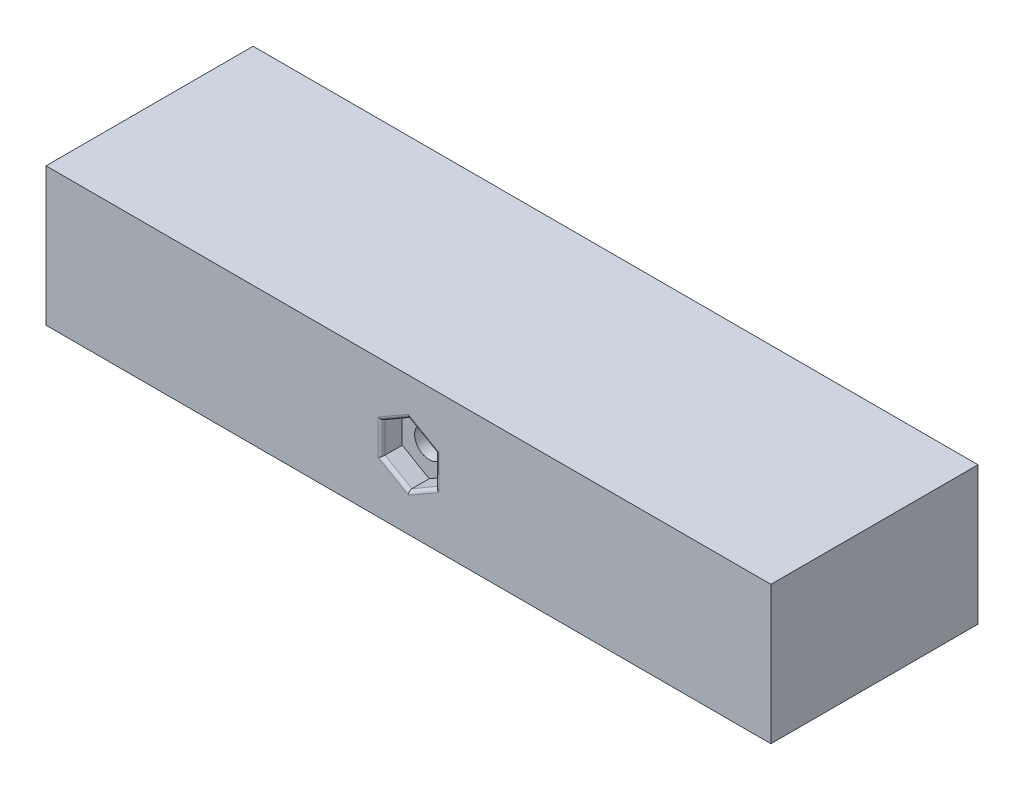
ISO-10303-21;
HEADER;
FILE_DESCRIPTION(('STEP AP214'),'2;1');
FILE_NAME('part.step','',(''),(''),'','','');
FILE_SCHEMA(('AUTOMOTIVE_DESIGN { 1 0 10303 214 1 1 1 1 }'));
ENDSEC;
DATA;
#1=APPLICATION_CONTEXT('core data for automotive mechanical design processes');
#2=APPLICATION_PROTOCOL_DEFINITION('international standard','automotive_design',2000,#1);
#3=PRODUCT_CONTEXT('',#1,'mechanical');
#4=PRODUCT('Part','Part','',(#3));
#5=PRODUCT_RELATED_PRODUCT_CATEGORY('part','',(#4));
#6=PRODUCT_DEFINITION_FORMATION('','',#4);
#7=PRODUCT_DEFINITION_CONTEXT('part definition',#1,'design');
#8=PRODUCT_DEFINITION('design','',#6,#7);
#9=PRODUCT_DEFINITION_SHAPE('','',#8);
#10=(LENGTH_UNIT() NAMED_UNIT(*) SI_UNIT(.MILLI.,.METRE.));
#11=(NAMED_UNIT(*) PLANE_ANGLE_UNIT() SI_UNIT($,.RADIAN.));
#12=(NAMED_UNIT(*) SI_UNIT($,.STERADIAN.) SOLID_ANGLE_UNIT());
#13=UNCERTAINTY_MEASURE_WITH_UNIT(LENGTH_MEASURE(1.E-05),#10,'distance_accuracy_value','');
#14=(GEOMETRIC_REPRESENTATION_CONTEXT(3) GLOBAL_UNCERTAINTY_ASSIGNED_CONTEXT((#13)) GLOBAL_UNIT_ASSIGNED_CONTEXT((#10,
#11,#12)) REPRESENTATION_CONTEXT('',''));
#15=CARTESIAN_POINT('',(0.,0.,0.));
#16=DIRECTION('',(0.,0.,1.));
#17=DIRECTION('',(1.,0.,0.));
#18=AXIS2_PLACEMENT_3D('',#15,#16,#17);
#19=CARTESIAN_POINT('',(0.,0.,0.));
#20=DIRECTION('',(0.,0.,1.));
#21=DIRECTION('',(1.,0.,0.));
#22=AXIS2_PLACEMENT_3D('',#19,#20,#21);
#23=PLANE('',#22);
#24=DIRECTION('',(0.,1.,0.));
#25=VECTOR('',#24,1.);
#26=CARTESIAN_POINT('',(0.,0.,0.));
#27=LINE('',#26,#25);
#28=CARTESIAN_POINT('',(0.,0.,0.));
#29=VERTEX_POINT('',#28);
#30=CARTESIAN_POINT('',(0.,20.,0.));
#31=VERTEX_POINT('',#30);
#32=EDGE_CURVE('E389',#29,#31,#27,.T.);
#33=ORIENTED_EDGE('',*,*,#32,.F.);
#34=DIRECTION('',(1.,0.,0.));
#35=VECTOR('',#34,1.);
#36=CARTESIAN_POINT('',(0.,0.,0.));
#37=LINE('',#36,#35);
#38=CARTESIAN_POINT('',(-105.,0.,0.));
#39=VERTEX_POINT('',#38);
#40=EDGE_CURVE('E408',#39,#29,#37,.T.);
#41=ORIENTED_EDGE('',*,*,#40,.F.);
#42=DIRECTION('',(0.,-1.,0.));
#43=VECTOR('',#42,1.);
#44=CARTESIAN_POINT('',(-105.,0.,0.));
#45=LINE('',#44,#43);
#46=CARTESIAN_POINT('',(-105.,20.,0.));
#47=VERTEX_POINT('',#46);
#48=EDGE_CURVE('E419',#47,#39,#45,.T.);
#49=ORIENTED_EDGE('',*,*,#48,.F.);
#50=DIRECTION('',(-1.,0.,0.));
#51=VECTOR('',#50,1.);
#52=CARTESIAN_POINT('',(0.,20.,0.));
#53=LINE('',#52,#51);
#54=EDGE_CURVE('E417',#31,#47,#53,.T.);
#55=ORIENTED_EDGE('',*,*,#54,.F.);
#56=EDGE_LOOP('',(#33,#41,#49,#55));
#57=FACE_BOUND('',#56,.T.);
#58=CARTESIAN_POINT('',(-52.5,9.99999999999999,0.));
#59=DIRECTION('',(0.,0.,1.));
#60=DIRECTION('',(1.,0.,0.));
#61=AXIS2_PLACEMENT_3D('',#58,#59,#60);
#62=CIRCLE('',#61,2.10377415285356);
#63=CARTESIAN_POINT('',(-50.3962258471464,9.99999999999999,0.));
#64=VERTEX_POINT('',#63);
#65=EDGE_CURVE('E361',#64,#64,#62,.T.);
#66=ORIENTED_EDGE('',*,*,#65,.T.);
#67=EDGE_LOOP('',(#66));
#68=FACE_BOUND('',#67,.T.);
#69=ADVANCED_FACE('F33',(#57,#68),#23,.F.);
#70=CARTESIAN_POINT('',(0.,0.,27.));
#71=DIRECTION('',(0.,0.,1.));
#72=DIRECTION('',(1.,0.,0.));
#73=AXIS2_PLACEMENT_3D('',#70,#71,#72);
#74=PLANE('',#73);
#75=DIRECTION('',(0.866025403784439,-0.499999999999999,0.));
#76=VECTOR('',#75,1.);
#77=CARTESIAN_POINT('',(-56.4,7.74833395016045,27.));
#78=LINE('',#77,#76);
#79=CARTESIAN_POINT('',(-56.4,7.74833395016045,27.));
#80=VERTEX_POINT('',#79);
#81=CARTESIAN_POINT('',(-52.5,5.49666790032091,27.));
#82=VERTEX_POINT('',#81);
#83=EDGE_CURVE('E366',#80,#82,#78,.T.);
#84=ORIENTED_EDGE('',*,*,#83,.T.);
#85=DIRECTION('',(0.866025403784438,0.500000000000001,0.));
#86=VECTOR('',#85,1.);
#87=CARTESIAN_POINT('',(-52.5,5.49666790032091,27.));
#88=LINE('',#87,#86);
#89=CARTESIAN_POINT('',(-48.6,7.74833395016046,27.));
#90=VERTEX_POINT('',#89);
#91=EDGE_CURVE('E369',#82,#90,#88,.T.);
#92=ORIENTED_EDGE('',*,*,#91,.T.);
#93=DIRECTION('',(0.,1.,0.));
#94=VECTOR('',#93,1.);
#95=CARTESIAN_POINT('',(-48.6,7.74833395016046,27.));
#96=LINE('',#95,#94);
#97=CARTESIAN_POINT('',(-48.6,12.2516660498395,27.));
#98=VERTEX_POINT('',#97);
#99=EDGE_CURVE('E373',#90,#98,#96,.T.);
#100=ORIENTED_EDGE('',*,*,#99,.T.);
#101=DIRECTION('',(-0.866025403784439,0.5,0.));
#102=VECTOR('',#101,1.);
#103=CARTESIAN_POINT('',(-48.6,12.2516660498395,27.));
#104=LINE('',#103,#102);
#105=CARTESIAN_POINT('',(-52.5,14.5033320996791,27.));
#106=VERTEX_POINT('',#105);
#107=EDGE_CURVE('E376',#98,#106,#104,.T.);
#108=ORIENTED_EDGE('',*,*,#107,.T.);
#109=DIRECTION('',(-0.866025403784438,-0.500000000000001,0.));
#110=VECTOR('',#109,1.);
#111=CARTESIAN_POINT('',(-52.5,14.5033320996791,27.));
#112=LINE('',#111,#110);
#113=CARTESIAN_POINT('',(-56.4,12.2516660498395,27.));
#114=VERTEX_POINT('',#113);
#115=EDGE_CURVE('E379',#106,#114,#112,.T.);
#116=ORIENTED_EDGE('',*,*,#115,.T.);
#117=DIRECTION('',(0.,-1.,0.));
#118=VECTOR('',#117,1.);
#119=CARTESIAN_POINT('',(-56.4,12.2516660498395,27.));
#120=LINE('',#119,#118);
#121=EDGE_CURVE('E382',#114,#80,#120,.T.);
#122=ORIENTED_EDGE('',*,*,#121,.T.);
#123=EDGE_LOOP('',(#84,#92,#100,#108,#116,#122));
#124=FACE_BOUND('',#123,.T.);
#125=CARTESIAN_POINT('',(-52.5,9.99999999999999,27.));
#126=DIRECTION('',(0.,0.,1.));
#127=DIRECTION('',(1.,0.,0.));
#128=AXIS2_PLACEMENT_3D('',#125,#126,#127);
#129=CIRCLE('',#128,2.10377415285356);
#130=CARTESIAN_POINT('',(-50.3962258471464,9.99999999999999,27.));
#131=VERTEX_POINT('',#130);
#132=EDGE_CURVE('E37',#131,#131,#129,.F.);
#133=ORIENTED_EDGE('',*,*,#132,.T.);
#134=EDGE_LOOP('',(#133));
#135=FACE_BOUND('',#134,.T.);
#136=ADVANCED_FACE('F499',(#124,#135),#74,.T.);
#137=CARTESIAN_POINT('',(0.,0.,30.));
#138=DIRECTION('',(-1.,0.,0.));
#139=DIRECTION('',(0.,-1.,0.));
#140=AXIS2_PLACEMENT_3D('',#137,#138,#139);
#141=PLANE('',#140);
#142=ORIENTED_EDGE('',*,*,#32,.T.);
#143=DIRECTION('',(0.,0.,-1.));
#144=VECTOR('',#143,1.);
#145=CARTESIAN_POINT('',(0.,20.,30.));
#146=LINE('',#145,#144);
#147=CARTESIAN_POINT('',(0.,20.,30.));
#148=VERTEX_POINT('',#147);
#149=EDGE_CURVE('E430',#148,#31,#146,.T.);
#150=ORIENTED_EDGE('',*,*,#149,.F.);
#151=DIRECTION('',(0.,1.,0.));
#152=VECTOR('',#151,1.);
#153=CARTESIAN_POINT('',(0.,0.,30.));
#154=LINE('',#153,#152);
#155=CARTESIAN_POINT('',(0.,0.,30.));
#156=VERTEX_POINT('',#155);
#157=EDGE_CURVE('E404',#156,#148,#154,.T.);
#158=ORIENTED_EDGE('',*,*,#157,.F.);
#159=DIRECTION('',(0.,0.,-1.));
#160=VECTOR('',#159,1.);
#161=CARTESIAN_POINT('',(0.,0.,30.));
#162=LINE('',#161,#160);
#163=EDGE_CURVE('E414',#156,#29,#162,.T.);
#164=ORIENTED_EDGE('',*,*,#163,.T.);
#165=EDGE_LOOP('',(#142,#150,#158,#164));
#166=FACE_BOUND('',#165,.T.);
#167=ADVANCED_FACE('F538',(#166),#141,.F.);
#168=CARTESIAN_POINT('',(0.,20.,30.));
#169=DIRECTION('',(0.,-1.,0.));
#170=DIRECTION('',(1.,0.,0.));
#171=AXIS2_PLACEMENT_3D('',#168,#169,#170);
#172=PLANE('',#171);
#173=ORIENTED_EDGE('',*,*,#54,.T.);
#174=DIRECTION('',(0.,0.,-1.));
#175=VECTOR('',#174,1.);
#176=CARTESIAN_POINT('',(-105.,20.,30.));
#177=LINE('',#176,#175);
#178=CARTESIAN_POINT('',(-105.,20.,30.));
#179=VERTEX_POINT('',#178);
#180=EDGE_CURVE('E427',#179,#47,#177,.T.);
#181=ORIENTED_EDGE('',*,*,#180,.F.);
#182=DIRECTION('',(-1.,0.,0.));
#183=VECTOR('',#182,1.);
#184=CARTESIAN_POINT('',(0.,20.,30.));
#185=LINE('',#184,#183);
#186=EDGE_CURVE('E407',#148,#179,#185,.T.);
#187=ORIENTED_EDGE('',*,*,#186,.F.);
#188=ORIENTED_EDGE('',*,*,#149,.T.);
#189=EDGE_LOOP('',(#173,#181,#187,#188));
#190=FACE_BOUND('',#189,.T.);
#191=ADVANCED_FACE('F552',(#190),#172,.F.);
#192=CARTESIAN_POINT('',(-105.,0.,30.));
#193=DIRECTION('',(1.,0.,0.));
#194=DIRECTION('',(0.,0.,-1.));
#195=AXIS2_PLACEMENT_3D('',#192,#193,#194);
#196=PLANE('',#195);
#197=ORIENTED_EDGE('',*,*,#48,.T.);
#198=DIRECTION('',(0.,0.,-1.));
#199=VECTOR('',#198,1.);
#200=CARTESIAN_POINT('',(-105.,0.,30.));
#201=LINE('',#200,#199);
#202=CARTESIAN_POINT('',(-105.,0.,30.));
#203=VERTEX_POINT('',#202);
#204=EDGE_CURVE('E424',#203,#39,#201,.T.);
#205=ORIENTED_EDGE('',*,*,#204,.F.);
#206=DIRECTION('',(0.,-1.,0.));
#207=VECTOR('',#206,1.);
#208=CARTESIAN_POINT('',(-105.,0.,30.));
#209=LINE('',#208,#207);
#210=EDGE_CURVE('E410',#179,#203,#209,.T.);
#211=ORIENTED_EDGE('',*,*,#210,.F.);
#212=ORIENTED_EDGE('',*,*,#180,.T.);
#213=EDGE_LOOP('',(#197,#205,#211,#212));
#214=FACE_BOUND('',#213,.T.);
#215=ADVANCED_FACE('F548',(#214),#196,.F.);
#216=CARTESIAN_POINT('',(0.,0.,30.));
#217=DIRECTION('',(0.,1.,0.));
#218=DIRECTION('',(-1.,0.,0.));
#219=AXIS2_PLACEMENT_3D('',#216,#217,#218);
#220=PLANE('',#219);
#221=DIRECTION('',(1.,0.,0.));
#222=VECTOR('',#221,1.);
#223=CARTESIAN_POINT('',(-100.,0.,5.));
#224=LINE('',#223,#222);
#225=CARTESIAN_POINT('',(-100.,0.,5.));
#226=VERTEX_POINT('',#225);
#227=CARTESIAN_POINT('',(-80.,0.,5.));
#228=VERTEX_POINT('',#227);
#229=EDGE_CURVE('E254',#226,#228,#224,.T.);
#230=ORIENTED_EDGE('',*,*,#229,.F.);
#231=DIRECTION('',(0.,0.,-1.));
#232=VECTOR('',#231,1.);
#233=CARTESIAN_POINT('',(-100.,0.,10.));
#234=LINE('',#233,#232);
#235=CARTESIAN_POINT('',(-100.,0.,10.));
#236=VERTEX_POINT('',#235);
#237=EDGE_CURVE('E50',#236,#226,#234,.T.);
#238=ORIENTED_EDGE('',*,*,#237,.F.);
#239=DIRECTION('',(-1.,0.,0.));
#240=VECTOR('',#239,1.);
#241=CARTESIAN_POINT('',(-100.,0.,10.));
#242=LINE('',#241,#240);
#243=CARTESIAN_POINT('',(-80.,0.,10.));
#244=VERTEX_POINT('',#243);
#245=EDGE_CURVE('E245',#244,#236,#242,.T.);
#246=ORIENTED_EDGE('',*,*,#245,.F.);
#247=DIRECTION('',(0.,0.,1.));
#248=VECTOR('',#247,1.);
#249=CARTESIAN_POINT('',(-80.,0.,10.));
#250=LINE('',#249,#248);
#251=EDGE_CURVE('E248',#228,#244,#250,.T.);
#252=ORIENTED_EDGE('',*,*,#251,.F.);
#253=EDGE_LOOP('',(#230,#238,#246,#252));
#254=FACE_BOUND('',#253,.T.);
#255=DIRECTION('',(1.,0.,0.));
#256=VECTOR('',#255,1.);
#257=CARTESIAN_POINT('',(-98.61,0.,12.5));
#258=LINE('',#257,#256);
#259=CARTESIAN_POINT('',(-98.61,0.,12.5));
#260=VERTEX_POINT('',#259);
#261=CARTESIAN_POINT('',(-93.61,0.,12.5));
#262=VERTEX_POINT('',#261);
#263=EDGE_CURVE('E278',#260,#262,#258,.T.);
#264=ORIENTED_EDGE('',*,*,#263,.F.);
#265=DIRECTION('',(0.,0.,-1.));
#266=VECTOR('',#265,1.);
#267=CARTESIAN_POINT('',(-98.61,0.,27.5));
#268=LINE('',#267,#266);
#269=CARTESIAN_POINT('',(-98.61,0.,27.5));
#270=VERTEX_POINT('',#269);
#271=EDGE_CURVE('E58',#270,#260,#268,.T.);
#272=ORIENTED_EDGE('',*,*,#271,.F.);
#273=DIRECTION('',(-1.,0.,0.));
#274=VECTOR('',#273,1.);
#275=CARTESIAN_POINT('',(-98.61,0.,27.5));
#276=LINE('',#275,#274);
#277=CARTESIAN_POINT('',(-93.61,0.,27.5));
#278=VERTEX_POINT('',#277);
#279=EDGE_CURVE('E267',#278,#270,#276,.T.);
#280=ORIENTED_EDGE('',*,*,#279,.F.);
#281=DIRECTION('',(0.,0.,1.));
#282=VECTOR('',#281,1.);
#283=CARTESIAN_POINT('',(-93.61,0.,27.5));
#284=LINE('',#283,#282);
#285=EDGE_CURVE('E281',#262,#278,#284,.T.);
#286=ORIENTED_EDGE('',*,*,#285,.F.);
#287=EDGE_LOOP('',(#264,#272,#280,#286));
#288=FACE_BOUND('',#287,.T.);
#289=DIRECTION('',(1.,0.,0.));
#290=VECTOR('',#289,1.);
#291=CARTESIAN_POINT('',(-11.39,0.,12.5));
#292=LINE('',#291,#290);
#293=CARTESIAN_POINT('',(-11.39,0.,12.5));
#294=VERTEX_POINT('',#293);
#295=CARTESIAN_POINT('',(-6.39,0.,12.5));
#296=VERTEX_POINT('',#295);
#297=EDGE_CURVE('E309',#294,#296,#292,.T.);
#298=ORIENTED_EDGE('',*,*,#297,.F.);
#299=DIRECTION('',(0.,0.,-1.));
#300=VECTOR('',#299,1.);
#301=CARTESIAN_POINT('',(-11.39,0.,27.5));
#302=LINE('',#301,#300);
#303=CARTESIAN_POINT('',(-11.39,0.,27.5));
#304=VERTEX_POINT('',#303);
#305=EDGE_CURVE('E288',#304,#294,#302,.T.);
#306=ORIENTED_EDGE('',*,*,#305,.F.);
#307=DIRECTION('',(-1.,0.,0.));
#308=VECTOR('',#307,1.);
#309=CARTESIAN_POINT('',(-11.39,0.,27.5));
#310=LINE('',#309,#308);
#311=CARTESIAN_POINT('',(-6.39,0.,27.5));
#312=VERTEX_POINT('',#311);
#313=EDGE_CURVE('E298',#312,#304,#310,.T.);
#314=ORIENTED_EDGE('',*,*,#313,.F.);
#315=DIRECTION('',(0.,0.,1.));
#316=VECTOR('',#315,1.);
#317=CARTESIAN_POINT('',(-6.39,0.,27.5));
#318=LINE('',#317,#316);
#319=EDGE_CURVE('E312',#296,#312,#318,.T.);
#320=ORIENTED_EDGE('',*,*,#319,.F.);
#321=EDGE_LOOP('',(#298,#306,#314,#320));
#322=FACE_BOUND('',#321,.T.);
#323=DIRECTION('',(1.,0.,0.));
#324=VECTOR('',#323,1.);
#325=CARTESIAN_POINT('',(-25.,0.,5.));
#326=LINE('',#325,#324);
#327=CARTESIAN_POINT('',(-25.,0.,5.));
#328=VERTEX_POINT('',#327);
#329=CARTESIAN_POINT('',(-5.,0.,5.));
#330=VERTEX_POINT('',#329);
#331=EDGE_CURVE('E341',#328,#330,#326,.T.);
#332=ORIENTED_EDGE('',*,*,#331,.F.);
#333=DIRECTION('',(0.,0.,-1.));
#334=VECTOR('',#333,1.);
#335=CARTESIAN_POINT('',(-25.,0.,10.));
#336=LINE('',#335,#334);
#337=CARTESIAN_POINT('',(-25.,0.,10.));
#338=VERTEX_POINT('',#337);
#339=EDGE_CURVE('E319',#338,#328,#336,.T.);
#340=ORIENTED_EDGE('',*,*,#339,.F.);
#341=DIRECTION('',(-1.,0.,0.));
#342=VECTOR('',#341,1.);
#343=CARTESIAN_POINT('',(-25.,0.,10.));
#344=LINE('',#343,#342);
#345=CARTESIAN_POINT('',(-5.,0.,10.));
#346=VERTEX_POINT('',#345);
#347=EDGE_CURVE('E330',#346,#338,#344,.T.);
#348=ORIENTED_EDGE('',*,*,#347,.F.);
#349=DIRECTION('',(0.,0.,1.));
#350=VECTOR('',#349,1.);
#351=CARTESIAN_POINT('',(-5.,0.,10.));
#352=LINE('',#351,#350);
#353=EDGE_CURVE('E344',#330,#346,#352,.T.);
#354=ORIENTED_EDGE('',*,*,#353,.F.);
#355=EDGE_LOOP('',(#332,#340,#348,#354));
#356=FACE_BOUND('',#355,.T.);
#357=CARTESIAN_POINT('',(-52.5,0.,20.));
#358=DIRECTION('',(0.,-1.,0.));
#359=DIRECTION('',(1.,0.,0.));
#360=AXIS2_PLACEMENT_3D('',#357,#358,#359);
#361=CIRCLE('',#360,2.);
#362=CARTESIAN_POINT('',(-50.5,0.,20.));
#363=VERTEX_POINT('',#362);
#364=EDGE_CURVE('E351',#363,#363,#361,.T.);
#365=ORIENTED_EDGE('',*,*,#364,.F.);
#366=EDGE_LOOP('',(#365));
#367=FACE_BOUND('',#366,.T.);
#368=ORIENTED_EDGE('',*,*,#40,.T.);
#369=ORIENTED_EDGE('',*,*,#163,.F.);
#370=DIRECTION('',(1.,0.,0.));
#371=VECTOR('',#370,1.);
#372=CARTESIAN_POINT('',(0.,0.,30.));
#373=LINE('',#372,#371);
#374=EDGE_CURVE('E412',#203,#156,#373,.T.);
#375=ORIENTED_EDGE('',*,*,#374,.F.);
#376=ORIENTED_EDGE('',*,*,#204,.T.);
#377=EDGE_LOOP('',(#368,#369,#375,#376));
#378=FACE_BOUND('',#377,.T.);
#379=ADVANCED_FACE('F545',(#254,#288,#322,#356,#367,#378),#220,.F.);
#380=CARTESIAN_POINT('',(0.,0.,30.));
#381=DIRECTION('',(0.,0.,1.));
#382=DIRECTION('',(1.,0.,0.));
#383=AXIS2_PLACEMENT_3D('',#380,#381,#382);
#384=PLANE('',#383);
#385=DIRECTION('',(0.866025403784439,-0.499999999999999,0.));
#386=VECTOR('',#385,1.);
#387=CARTESIAN_POINT('',(-56.65,7.31532124826823,30.));
#388=LINE('',#387,#386);
#389=CARTESIAN_POINT('',(-52.5,4.91931763113129,30.));
#390=VERTEX_POINT('',#389);
#391=CARTESIAN_POINT('',(-56.9,7.45965881556563,30.));
#392=VERTEX_POINT('',#391);
#393=EDGE_CURVE('E444',#390,#392,#388,.F.);
#394=ORIENTED_EDGE('',*,*,#393,.T.);
#395=DIRECTION('',(0.,-1.,0.));
#396=VECTOR('',#395,1.);
#397=CARTESIAN_POINT('',(-56.9,12.2516660498395,30.));
#398=LINE('',#397,#396);
#399=CARTESIAN_POINT('',(-56.9,12.5403411844343,30.));
#400=VERTEX_POINT('',#399);
#401=EDGE_CURVE('E446',#392,#400,#398,.F.);
#402=ORIENTED_EDGE('',*,*,#401,.T.);
#403=DIRECTION('',(-0.866025403784438,-0.500000000000001,0.));
#404=VECTOR('',#403,1.);
#405=CARTESIAN_POINT('',(-52.75,14.9363448015713,30.));
#406=LINE('',#405,#404);
#407=CARTESIAN_POINT('',(-52.5,15.0806823688687,30.));
#408=VERTEX_POINT('',#407);
#409=EDGE_CURVE('E436',#400,#408,#406,.F.);
#410=ORIENTED_EDGE('',*,*,#409,.T.);
#411=DIRECTION('',(-0.866025403784439,0.5,0.));
#412=VECTOR('',#411,1.);
#413=CARTESIAN_POINT('',(-48.35,12.6846787517318,30.));
#414=LINE('',#413,#412);
#415=CARTESIAN_POINT('',(-48.1,12.5403411844343,30.));
#416=VERTEX_POINT('',#415);
#417=EDGE_CURVE('E438',#408,#416,#414,.F.);
#418=ORIENTED_EDGE('',*,*,#417,.T.);
#419=DIRECTION('',(0.,1.,0.));
#420=VECTOR('',#419,1.);
#421=CARTESIAN_POINT('',(-48.1,7.74833395016046,30.));
#422=LINE('',#421,#420);
#423=CARTESIAN_POINT('',(-48.1,7.45965881556565,30.));
#424=VERTEX_POINT('',#423);
#425=EDGE_CURVE('E440',#416,#424,#422,.F.);
#426=ORIENTED_EDGE('',*,*,#425,.T.);
#427=DIRECTION('',(0.866025403784438,0.500000000000001,0.));
#428=VECTOR('',#427,1.);
#429=CARTESIAN_POINT('',(-52.25,5.0636551984287,30.));
#430=LINE('',#429,#428);
#431=EDGE_CURVE('E442',#424,#390,#430,.F.);
#432=ORIENTED_EDGE('',*,*,#431,.T.);
#433=EDGE_LOOP('',(#394,#402,#410,#418,#426,#432));
#434=FACE_BOUND('',#433,.T.);
#435=ORIENTED_EDGE('',*,*,#157,.T.);
#436=ORIENTED_EDGE('',*,*,#186,.T.);
#437=ORIENTED_EDGE('',*,*,#210,.T.);
#438=ORIENTED_EDGE('',*,*,#374,.T.);
#439=EDGE_LOOP('',(#435,#436,#437,#438));
#440=FACE_BOUND('',#439,.T.);
#441=ADVANCED_FACE('F481',(#434,#440),#384,.T.);
#442=CARTESIAN_POINT('',(-56.4,7.74833395016045,27.));
#443=DIRECTION('',(-0.499999999999999,-0.866025403784439,0.));
#444=DIRECTION('',(0.866025403784439,-0.499999999999999,0.));
#445=AXIS2_PLACEMENT_3D('',#442,#443,#444);
#446=PLANE('',#445);
#447=DIRECTION('',(0.,0.,1.));
#448=VECTOR('',#447,1.);
#449=CARTESIAN_POINT('',(-56.4,7.74833395016045,27.));
#450=LINE('',#449,#448);
#451=CARTESIAN_POINT('',(-56.4,7.74833395016045,29.5));
#452=VERTEX_POINT('',#451);
#453=EDGE_CURVE('E386',#80,#452,#450,.T.);
#454=ORIENTED_EDGE('',*,*,#453,.T.);
#455=DIRECTION('',(0.866025403784439,-0.499999999999999,0.));
#456=VECTOR('',#455,1.);
#457=CARTESIAN_POINT('',(-52.5,5.49666790032091,29.5));
#458=LINE('',#457,#456);
#459=CARTESIAN_POINT('',(-52.5,5.49666790032091,29.5));
#460=VERTEX_POINT('',#459);
#461=EDGE_CURVE('E449',#452,#460,#458,.T.);
#462=ORIENTED_EDGE('',*,*,#461,.T.);
#463=DIRECTION('',(0.,0.,1.));
#464=VECTOR('',#463,1.);
#465=CARTESIAN_POINT('',(-52.5,5.49666790032091,27.));
#466=LINE('',#465,#464);
#467=EDGE_CURVE('E385',#82,#460,#466,.T.);
#468=ORIENTED_EDGE('',*,*,#467,.F.);
#469=ORIENTED_EDGE('',*,*,#83,.F.);
#470=EDGE_LOOP('',(#454,#462,#468,#469));
#471=FACE_BOUND('',#470,.T.);
#472=ADVANCED_FACE('F571',(#471),#446,.F.);
#473=CARTESIAN_POINT('',(-56.4,12.2516660498395,27.));
#474=DIRECTION('',(-1.,0.,0.));
#475=DIRECTION('',(0.,0.,1.));
#476=AXIS2_PLACEMENT_3D('',#473,#474,#475);
#477=PLANE('',#476);
#478=DIRECTION('',(0.,0.,1.));
#479=VECTOR('',#478,1.);
#480=CARTESIAN_POINT('',(-56.4,12.2516660498395,27.));
#481=LINE('',#480,#479);
#482=CARTESIAN_POINT('',(-56.4,12.2516660498395,29.5));
#483=VERTEX_POINT('',#482);
#484=EDGE_CURVE('E390',#114,#483,#481,.T.);
#485=ORIENTED_EDGE('',*,*,#484,.T.);
#486=DIRECTION('',(0.,-1.,0.));
#487=VECTOR('',#486,1.);
#488=CARTESIAN_POINT('',(-56.4,7.74833395016045,29.5));
#489=LINE('',#488,#487);
#490=EDGE_CURVE('E433',#483,#452,#489,.T.);
#491=ORIENTED_EDGE('',*,*,#490,.T.);
#492=ORIENTED_EDGE('',*,*,#453,.F.);
#493=ORIENTED_EDGE('',*,*,#121,.F.);
#494=EDGE_LOOP('',(#485,#491,#492,#493));
#495=FACE_BOUND('',#494,.T.);
#496=ADVANCED_FACE('F496',(#495),#477,.F.);
#497=CARTESIAN_POINT('',(-52.5,14.5033320996791,27.));
#498=DIRECTION('',(-0.500000000000001,0.866025403784438,0.));
#499=DIRECTION('',(-0.866025403784438,-0.500000000000001,0.));
#500=AXIS2_PLACEMENT_3D('',#497,#498,#499);
#501=PLANE('',#500);
#502=DIRECTION('',(0.,0.,1.));
#503=VECTOR('',#502,1.);
#504=CARTESIAN_POINT('',(-52.5,14.5033320996791,27.));
#505=LINE('',#504,#503);
#506=CARTESIAN_POINT('',(-52.5,14.5033320996791,29.5));
#507=VERTEX_POINT('',#506);
#508=EDGE_CURVE('E393',#106,#507,#505,.T.);
#509=ORIENTED_EDGE('',*,*,#508,.T.);
#510=DIRECTION('',(-0.866025403784438,-0.500000000000001,0.));
#511=VECTOR('',#510,1.);
#512=CARTESIAN_POINT('',(-56.4,12.2516660498395,29.5));
#513=LINE('',#512,#511);
#514=EDGE_CURVE('E11',#507,#483,#513,.T.);
#515=ORIENTED_EDGE('',*,*,#514,.T.);
#516=ORIENTED_EDGE('',*,*,#484,.F.);
#517=ORIENTED_EDGE('',*,*,#115,.F.);
#518=EDGE_LOOP('',(#509,#515,#516,#517));
#519=FACE_BOUND('',#518,.T.);
#520=ADVANCED_FACE('F492',(#519),#501,.F.);
#521=CARTESIAN_POINT('',(-48.6,12.2516660498395,27.));
#522=DIRECTION('',(0.5,0.866025403784439,0.));
#523=DIRECTION('',(-0.866025403784439,0.5,0.));
#524=AXIS2_PLACEMENT_3D('',#521,#522,#523);
#525=PLANE('',#524);
#526=DIRECTION('',(0.,0.,1.));
#527=VECTOR('',#526,1.);
#528=CARTESIAN_POINT('',(-48.6,12.2516660498395,27.));
#529=LINE('',#528,#527);
#530=CARTESIAN_POINT('',(-48.6,12.2516660498395,29.5));
#531=VERTEX_POINT('',#530);
#532=EDGE_CURVE('E396',#98,#531,#529,.T.);
#533=ORIENTED_EDGE('',*,*,#532,.T.);
#534=DIRECTION('',(-0.866025403784439,0.5,0.));
#535=VECTOR('',#534,1.);
#536=CARTESIAN_POINT('',(-52.5,14.5033320996791,29.5));
#537=LINE('',#536,#535);
#538=EDGE_CURVE('E42',#531,#507,#537,.T.);
#539=ORIENTED_EDGE('',*,*,#538,.T.);
#540=ORIENTED_EDGE('',*,*,#508,.F.);
#541=ORIENTED_EDGE('',*,*,#107,.F.);
#542=EDGE_LOOP('',(#533,#539,#540,#541));
#543=FACE_BOUND('',#542,.T.);
#544=ADVANCED_FACE('F504',(#543),#525,.F.);
#545=CARTESIAN_POINT('',(-48.6,7.74833395016046,27.));
#546=DIRECTION('',(1.,0.,0.));
#547=DIRECTION('',(0.,1.,0.));
#548=AXIS2_PLACEMENT_3D('',#545,#546,#547);
#549=PLANE('',#548);
#550=DIRECTION('',(0.,0.,1.));
#551=VECTOR('',#550,1.);
#552=CARTESIAN_POINT('',(-48.6,7.74833395016046,27.));
#553=LINE('',#552,#551);
#554=CARTESIAN_POINT('',(-48.6,7.74833395016046,29.5));
#555=VERTEX_POINT('',#554);
#556=EDGE_CURVE('E399',#90,#555,#553,.T.);
#557=ORIENTED_EDGE('',*,*,#556,.T.);
#558=DIRECTION('',(0.,1.,0.));
#559=VECTOR('',#558,1.);
#560=CARTESIAN_POINT('',(-48.6,12.2516660498395,29.5));
#561=LINE('',#560,#559);
#562=EDGE_CURVE('E453',#555,#531,#561,.T.);
#563=ORIENTED_EDGE('',*,*,#562,.T.);
#564=ORIENTED_EDGE('',*,*,#532,.F.);
#565=ORIENTED_EDGE('',*,*,#99,.F.);
#566=EDGE_LOOP('',(#557,#563,#564,#565));
#567=FACE_BOUND('',#566,.T.);
#568=ADVANCED_FACE('F506',(#567),#549,.F.);
#569=CARTESIAN_POINT('',(-52.5,5.49666790032091,27.));
#570=DIRECTION('',(0.500000000000001,-0.866025403784438,0.));
#571=DIRECTION('',(0.866025403784438,0.500000000000001,0.));
#572=AXIS2_PLACEMENT_3D('',#569,#570,#571);
#573=PLANE('',#572);
#574=ORIENTED_EDGE('',*,*,#467,.T.);
#575=DIRECTION('',(0.866025403784438,0.500000000000001,0.));
#576=VECTOR('',#575,1.);
#577=CARTESIAN_POINT('',(-48.6,7.74833395016046,29.5));
#578=LINE('',#577,#576);
#579=EDGE_CURVE('E451',#460,#555,#578,.T.);
#580=ORIENTED_EDGE('',*,*,#579,.T.);
#581=ORIENTED_EDGE('',*,*,#556,.F.);
#582=ORIENTED_EDGE('',*,*,#91,.F.);
#583=EDGE_LOOP('',(#574,#580,#581,#582));
#584=FACE_BOUND('',#583,.T.);
#585=ADVANCED_FACE('F509',(#584),#573,.F.);
#586=CARTESIAN_POINT('',(-48.1,7.74833395016046,29.5));
#587=DIRECTION('',(0.,-1.,0.));
#588=DIRECTION('',(1.,0.,0.));
#589=AXIS2_PLACEMENT_3D('',#586,#587,#588);
#590=CYLINDRICAL_SURFACE('',#589,0.5);
#591=CARTESIAN_POINT('',(-48.1,7.45965881556565,29.5));
#592=DIRECTION('',(-0.499999999999999,-0.866025403784439,0.));
#593=DIRECTION('',(-0.866025403784439,0.499999999999999,0.));
#594=AXIS2_PLACEMENT_3D('',#591,#592,#593);
#595=ELLIPSE('',#594,0.577350269189626,0.5);
#596=EDGE_CURVE('E466',#424,#555,#595,.T.);
#597=ORIENTED_EDGE('',*,*,#596,.F.);
#598=ORIENTED_EDGE('',*,*,#425,.F.);
#599=CARTESIAN_POINT('',(-48.1,12.5403411844343,29.5));
#600=DIRECTION('',(0.500000000000001,-0.866025403784438,0.));
#601=DIRECTION('',(-0.866025403784438,-0.500000000000001,0.));
#602=AXIS2_PLACEMENT_3D('',#599,#600,#601);
#603=ELLIPSE('',#602,0.577350269189626,0.5);
#604=EDGE_CURVE('E370',#531,#416,#603,.F.);
#605=ORIENTED_EDGE('',*,*,#604,.F.);
#606=ORIENTED_EDGE('',*,*,#562,.F.);
#607=EDGE_LOOP('',(#597,#598,#605,#606));
#608=FACE_BOUND('',#607,.T.);
#609=ADVANCED_FACE('F35',(#608),#590,.T.);
#610=CARTESIAN_POINT('',(-48.35,12.6846787517318,29.5));
#611=DIRECTION('',(0.866025403784439,-0.5,0.));
#612=DIRECTION('',(0.5,0.866025403784439,0.));
#613=AXIS2_PLACEMENT_3D('',#610,#611,#612);
#614=CYLINDRICAL_SURFACE('',#613,0.5);
#615=ORIENTED_EDGE('',*,*,#604,.T.);
#616=ORIENTED_EDGE('',*,*,#417,.F.);
#617=CARTESIAN_POINT('',(-52.5,15.0806823688687,29.5));
#618=DIRECTION('',(1.,0.,0.));
#619=DIRECTION('',(0.,-1.,0.));
#620=AXIS2_PLACEMENT_3D('',#617,#618,#619);
#621=ELLIPSE('',#620,0.577350269189626,0.5);
#622=EDGE_CURVE('E463',#507,#408,#621,.F.);
#623=ORIENTED_EDGE('',*,*,#622,.F.);
#624=ORIENTED_EDGE('',*,*,#538,.F.);
#625=EDGE_LOOP('',(#615,#616,#623,#624));
#626=FACE_BOUND('',#625,.T.);
#627=ADVANCED_FACE('F473',(#626),#614,.T.);
#628=CARTESIAN_POINT('',(-52.25,5.06365519842869,29.5));
#629=DIRECTION('',(-0.866025403784438,-0.500000000000001,0.));
#630=DIRECTION('',(0.500000000000001,-0.866025403784438,0.));
#631=AXIS2_PLACEMENT_3D('',#628,#629,#630);
#632=CYLINDRICAL_SURFACE('',#631,0.5);
#633=ORIENTED_EDGE('',*,*,#596,.T.);
#634=ORIENTED_EDGE('',*,*,#579,.F.);
#635=CARTESIAN_POINT('',(-52.5,4.91931763113129,29.5));
#636=DIRECTION('',(-1.,0.,0.));
#637=DIRECTION('',(0.,1.,0.));
#638=AXIS2_PLACEMENT_3D('',#635,#636,#637);
#639=ELLIPSE('',#638,0.577350269189626,0.5);
#640=EDGE_CURVE('E460',#390,#460,#639,.T.);
#641=ORIENTED_EDGE('',*,*,#640,.F.);
#642=ORIENTED_EDGE('',*,*,#431,.F.);
#643=EDGE_LOOP('',(#633,#634,#641,#642));
#644=FACE_BOUND('',#643,.T.);
#645=ADVANCED_FACE('F512',(#644),#632,.T.);
#646=CARTESIAN_POINT('',(-52.75,14.9363448015713,29.5));
#647=DIRECTION('',(0.866025403784438,0.500000000000001,0.));
#648=DIRECTION('',(-0.500000000000001,0.866025403784438,0.));
#649=AXIS2_PLACEMENT_3D('',#646,#647,#648);
#650=CYLINDRICAL_SURFACE('',#649,0.5);
#651=ORIENTED_EDGE('',*,*,#622,.T.);
#652=ORIENTED_EDGE('',*,*,#409,.F.);
#653=CARTESIAN_POINT('',(-56.9,12.5403411844343,29.5));
#654=DIRECTION('',(0.5,0.866025403784439,0.));
#655=DIRECTION('',(-0.866025403784439,0.5,0.));
#656=AXIS2_PLACEMENT_3D('',#653,#654,#655);
#657=ELLIPSE('',#656,0.577350269189626,0.5);
#658=EDGE_CURVE('E458',#483,#400,#657,.F.);
#659=ORIENTED_EDGE('',*,*,#658,.F.);
#660=ORIENTED_EDGE('',*,*,#514,.F.);
#661=EDGE_LOOP('',(#651,#652,#659,#660));
#662=FACE_BOUND('',#661,.T.);
#663=ADVANCED_FACE('F488',(#662),#650,.T.);
#664=CARTESIAN_POINT('',(-56.65,7.31532124826823,29.5));
#665=DIRECTION('',(-0.866025403784439,0.499999999999999,0.));
#666=DIRECTION('',(-0.499999999999999,-0.866025403784439,0.));
#667=AXIS2_PLACEMENT_3D('',#664,#665,#666);
#668=CYLINDRICAL_SURFACE('',#667,0.5);
#669=ORIENTED_EDGE('',*,*,#640,.T.);
#670=ORIENTED_EDGE('',*,*,#461,.F.);
#671=CARTESIAN_POINT('',(-56.9,7.45965881556563,29.5));
#672=DIRECTION('',(-0.500000000000001,0.866025403784438,0.));
#673=DIRECTION('',(0.866025403784438,0.500000000000001,0.));
#674=AXIS2_PLACEMENT_3D('',#671,#672,#673);
#675=ELLIPSE('',#674,0.577350269189626,0.5);
#676=EDGE_CURVE('E456',#392,#452,#675,.T.);
#677=ORIENTED_EDGE('',*,*,#676,.F.);
#678=ORIENTED_EDGE('',*,*,#393,.F.);
#679=EDGE_LOOP('',(#669,#670,#677,#678));
#680=FACE_BOUND('',#679,.T.);
#681=ADVANCED_FACE('F516',(#680),#668,.T.);
#682=CARTESIAN_POINT('',(-56.9,12.2516660498395,29.5));
#683=DIRECTION('',(0.,1.,0.));
#684=DIRECTION('',(0.,0.,1.));
#685=AXIS2_PLACEMENT_3D('',#682,#683,#684);
#686=CYLINDRICAL_SURFACE('',#685,0.5);
#687=ORIENTED_EDGE('',*,*,#658,.T.);
#688=ORIENTED_EDGE('',*,*,#401,.F.);
#689=ORIENTED_EDGE('',*,*,#676,.T.);
#690=ORIENTED_EDGE('',*,*,#490,.F.);
#691=EDGE_LOOP('',(#687,#688,#689,#690));
#692=FACE_BOUND('',#691,.T.);
#693=ADVANCED_FACE('F519',(#692),#686,.T.);
#694=CARTESIAN_POINT('',(-52.5,9.99999999999999,30.));
#695=DIRECTION('',(0.,0.,-1.));
#696=DIRECTION('',(-1.,0.,0.));
#697=AXIS2_PLACEMENT_3D('',#694,#695,#696);
#698=CYLINDRICAL_SURFACE('',#697,2.10377415285356);
#699=ORIENTED_EDGE('',*,*,#132,.F.);
#700=EDGE_LOOP('',(#699));
#701=FACE_BOUND('',#700,.T.);
#702=ORIENTED_EDGE('',*,*,#65,.F.);
#703=EDGE_LOOP('',(#702));
#704=FACE_BOUND('',#703,.T.);
#705=ADVANCED_FACE('F521',(#701,#704),#698,.F.);
#706=CARTESIAN_POINT('',(-52.5,4.99999999999999,20.));
#707=DIRECTION('',(0.,-1.,0.));
#708=DIRECTION('',(1.,0.,0.));
#709=AXIS2_PLACEMENT_3D('',#706,#707,#708);
#710=CYLINDRICAL_SURFACE('',#709,2.);
#711=CARTESIAN_POINT('',(-52.5,4.99999999999999,20.));
#712=DIRECTION('',(0.,-1.,0.));
#713=DIRECTION('',(1.,0.,0.));
#714=AXIS2_PLACEMENT_3D('',#711,#712,#713);
#715=CIRCLE('',#714,2.);
#716=CARTESIAN_POINT('',(-50.5,4.99999999999999,20.));
#717=VERTEX_POINT('',#716);
#718=EDGE_CURVE('E358',#717,#717,#715,.T.);
#719=ORIENTED_EDGE('',*,*,#718,.F.);
#720=EDGE_LOOP('',(#719));
#721=FACE_BOUND('',#720,.T.);
#722=ORIENTED_EDGE('',*,*,#364,.T.);
#723=EDGE_LOOP('',(#722));
#724=FACE_BOUND('',#723,.T.);
#725=ADVANCED_FACE('F527',(#721,#724),#710,.F.);
#726=CARTESIAN_POINT('',(-52.5,4.99999999999999,20.));
#727=DIRECTION('',(0.,-1.,0.));
#728=DIRECTION('',(1.,0.,0.));
#729=AXIS2_PLACEMENT_3D('',#726,#727,#728);
#730=PLANE('',#729);
#731=ORIENTED_EDGE('',*,*,#718,.T.);
#732=EDGE_LOOP('',(#731));
#733=FACE_BOUND('',#732,.T.);
#734=ADVANCED_FACE('F591',(#733),#730,.T.);
#735=CARTESIAN_POINT('',(-25.,8.,10.));
#736=DIRECTION('',(-1.,0.,0.));
#737=DIRECTION('',(0.,-1.,0.));
#738=AXIS2_PLACEMENT_3D('',#735,#736,#737);
#739=PLANE('',#738);
#740=ORIENTED_EDGE('',*,*,#339,.T.);
#741=DIRECTION('',(0.,-1.,0.));
#742=VECTOR('',#741,1.);
#743=CARTESIAN_POINT('',(-25.,8.,5.));
#744=LINE('',#743,#742);
#745=CARTESIAN_POINT('',(-25.,8.,5.));
#746=VERTEX_POINT('',#745);
#747=EDGE_CURVE('E339',#746,#328,#744,.T.);
#748=ORIENTED_EDGE('',*,*,#747,.F.);
#749=DIRECTION('',(0.,0.,-1.));
#750=VECTOR('',#749,1.);
#751=CARTESIAN_POINT('',(-25.,8.,10.));
#752=LINE('',#751,#750);
#753=CARTESIAN_POINT('',(-25.,8.,10.));
#754=VERTEX_POINT('',#753);
#755=EDGE_CURVE('E326',#754,#746,#752,.T.);
#756=ORIENTED_EDGE('',*,*,#755,.F.);
#757=DIRECTION('',(0.,-1.,0.));
#758=VECTOR('',#757,1.);
#759=CARTESIAN_POINT('',(-25.,8.,10.));
#760=LINE('',#759,#758);
#761=EDGE_CURVE('E349',#754,#338,#760,.T.);
#762=ORIENTED_EDGE('',*,*,#761,.T.);
#763=EDGE_LOOP('',(#740,#748,#756,#762));
#764=FACE_BOUND('',#763,.T.);
#765=ADVANCED_FACE('F595',(#764),#739,.F.);
#766=CARTESIAN_POINT('',(-25.,8.,10.));
#767=DIRECTION('',(0.,0.,1.));
#768=DIRECTION('',(1.,0.,0.));
#769=AXIS2_PLACEMENT_3D('',#766,#767,#768);
#770=PLANE('',#769);
#771=ORIENTED_EDGE('',*,*,#347,.T.);
#772=ORIENTED_EDGE('',*,*,#761,.F.);
#773=DIRECTION('',(-1.,0.,0.));
#774=VECTOR('',#773,1.);
#775=CARTESIAN_POINT('',(-25.,8.,10.));
#776=LINE('',#775,#774);
#777=CARTESIAN_POINT('',(-5.00000000000001,8.,10.));
#778=VERTEX_POINT('',#777);
#779=EDGE_CURVE('E336',#778,#754,#776,.T.);
#780=ORIENTED_EDGE('',*,*,#779,.F.);
#781=DIRECTION('',(0.,-1.,0.));
#782=VECTOR('',#781,1.);
#783=CARTESIAN_POINT('',(-5.00000000000001,8.,10.));
#784=LINE('',#783,#782);
#785=EDGE_CURVE('E352',#778,#346,#784,.T.);
#786=ORIENTED_EDGE('',*,*,#785,.T.);
#787=EDGE_LOOP('',(#771,#772,#780,#786));
#788=FACE_BOUND('',#787,.T.);
#789=ADVANCED_FACE('F599',(#788),#770,.F.);
#790=CARTESIAN_POINT('',(-5.00000000000001,8.,10.));
#791=DIRECTION('',(1.,0.,0.));
#792=DIRECTION('',(0.,1.,0.));
#793=AXIS2_PLACEMENT_3D('',#790,#791,#792);
#794=PLANE('',#793);
#795=ORIENTED_EDGE('',*,*,#353,.T.);
#796=ORIENTED_EDGE('',*,*,#785,.F.);
#797=DIRECTION('',(0.,0.,1.));
#798=VECTOR('',#797,1.);
#799=CARTESIAN_POINT('',(-5.00000000000001,8.,10.));
#800=LINE('',#799,#798);
#801=CARTESIAN_POINT('',(-5.00000000000001,8.,5.));
#802=VERTEX_POINT('',#801);
#803=EDGE_CURVE('E333',#802,#778,#800,.T.);
#804=ORIENTED_EDGE('',*,*,#803,.F.);
#805=DIRECTION('',(0.,-1.,0.));
#806=VECTOR('',#805,1.);
#807=CARTESIAN_POINT('',(-5.00000000000001,8.,5.));
#808=LINE('',#807,#806);
#809=EDGE_CURVE('E354',#802,#330,#808,.T.);
#810=ORIENTED_EDGE('',*,*,#809,.T.);
#811=EDGE_LOOP('',(#795,#796,#804,#810));
#812=FACE_BOUND('',#811,.T.);
#813=ADVANCED_FACE('F605',(#812),#794,.F.);
#814=CARTESIAN_POINT('',(-25.,8.,5.));
#815=DIRECTION('',(0.,0.,-1.));
#816=DIRECTION('',(-1.,0.,0.));
#817=AXIS2_PLACEMENT_3D('',#814,#815,#816);
#818=PLANE('',#817);
#819=ORIENTED_EDGE('',*,*,#331,.T.);
#820=ORIENTED_EDGE('',*,*,#809,.F.);
#821=DIRECTION('',(1.,0.,0.));
#822=VECTOR('',#821,1.);
#823=CARTESIAN_POINT('',(-25.,8.,5.));
#824=LINE('',#823,#822);
#825=EDGE_CURVE('E329',#746,#802,#824,.T.);
#826=ORIENTED_EDGE('',*,*,#825,.F.);
#827=ORIENTED_EDGE('',*,*,#747,.T.);
#828=EDGE_LOOP('',(#819,#820,#826,#827));
#829=FACE_BOUND('',#828,.T.);
#830=ADVANCED_FACE('F601',(#829),#818,.F.);
#831=CARTESIAN_POINT('',(0.,8.,0.));
#832=DIRECTION('',(0.,-1.,0.));
#833=DIRECTION('',(1.,0.,0.));
#834=AXIS2_PLACEMENT_3D('',#831,#832,#833);
#835=PLANE('',#834);
#836=ORIENTED_EDGE('',*,*,#755,.T.);
#837=ORIENTED_EDGE('',*,*,#825,.T.);
#838=ORIENTED_EDGE('',*,*,#803,.T.);
#839=ORIENTED_EDGE('',*,*,#779,.T.);
#840=EDGE_LOOP('',(#836,#837,#838,#839));
#841=FACE_BOUND('',#840,.T.);
#842=ADVANCED_FACE('F604',(#841),#835,.T.);
#843=CARTESIAN_POINT('',(-11.39,8.,27.5));
#844=DIRECTION('',(-1.,0.,0.));
#845=DIRECTION('',(0.,0.,1.));
#846=AXIS2_PLACEMENT_3D('',#843,#844,#845);
#847=PLANE('',#846);
#848=ORIENTED_EDGE('',*,*,#305,.T.);
#849=DIRECTION('',(0.,-1.,0.));
#850=VECTOR('',#849,1.);
#851=CARTESIAN_POINT('',(-11.39,8.,12.5));
#852=LINE('',#851,#850);
#853=CARTESIAN_POINT('',(-11.39,8.,12.5));
#854=VERTEX_POINT('',#853);
#855=EDGE_CURVE('E307',#854,#294,#852,.T.);
#856=ORIENTED_EDGE('',*,*,#855,.F.);
#857=DIRECTION('',(0.,0.,-1.));
#858=VECTOR('',#857,1.);
#859=CARTESIAN_POINT('',(-11.39,8.,27.5));
#860=LINE('',#859,#858);
#861=CARTESIAN_POINT('',(-11.39,8.,27.5));
#862=VERTEX_POINT('',#861);
#863=EDGE_CURVE('E294',#862,#854,#860,.T.);
#864=ORIENTED_EDGE('',*,*,#863,.F.);
#865=DIRECTION('',(0.,-1.,0.));
#866=VECTOR('',#865,1.);
#867=CARTESIAN_POINT('',(-11.39,8.,27.5));
#868=LINE('',#867,#866);
#869=EDGE_CURVE('E317',#862,#304,#868,.T.);
#870=ORIENTED_EDGE('',*,*,#869,.T.);
#871=EDGE_LOOP('',(#848,#856,#864,#870));
#872=FACE_BOUND('',#871,.T.);
#873=ADVANCED_FACE('F615',(#872),#847,.F.);
#874=CARTESIAN_POINT('',(-11.39,8.,27.5));
#875=DIRECTION('',(0.,0.,1.));
#876=DIRECTION('',(1.,0.,0.));
#877=AXIS2_PLACEMENT_3D('',#874,#875,#876);
#878=PLANE('',#877);
#879=ORIENTED_EDGE('',*,*,#313,.T.);
#880=ORIENTED_EDGE('',*,*,#869,.F.);
#881=DIRECTION('',(-1.,0.,0.));
#882=VECTOR('',#881,1.);
#883=CARTESIAN_POINT('',(-11.39,8.,27.5));
#884=LINE('',#883,#882);
#885=CARTESIAN_POINT('',(-6.39000000000001,8.,27.5));
#886=VERTEX_POINT('',#885);
#887=EDGE_CURVE('E304',#886,#862,#884,.T.);
#888=ORIENTED_EDGE('',*,*,#887,.F.);
#889=DIRECTION('',(0.,-1.,0.));
#890=VECTOR('',#889,1.);
#891=CARTESIAN_POINT('',(-6.39000000000001,8.,27.5));
#892=LINE('',#891,#890);
#893=EDGE_CURVE('E320',#886,#312,#892,.T.);
#894=ORIENTED_EDGE('',*,*,#893,.T.);
#895=EDGE_LOOP('',(#879,#880,#888,#894));
#896=FACE_BOUND('',#895,.T.);
#897=ADVANCED_FACE('F619',(#896),#878,.F.);
#898=CARTESIAN_POINT('',(-6.39000000000001,8.,27.5));
#899=DIRECTION('',(1.,0.,0.));
#900=DIRECTION('',(0.,0.,-1.));
#901=AXIS2_PLACEMENT_3D('',#898,#899,#900);
#902=PLANE('',#901);
#903=ORIENTED_EDGE('',*,*,#319,.T.);
#904=ORIENTED_EDGE('',*,*,#893,.F.);
#905=DIRECTION('',(0.,0.,1.));
#906=VECTOR('',#905,1.);
#907=CARTESIAN_POINT('',(-6.39000000000001,8.,27.5));
#908=LINE('',#907,#906);
#909=CARTESIAN_POINT('',(-6.39,8.,12.5));
#910=VERTEX_POINT('',#909);
#911=EDGE_CURVE('E301',#910,#886,#908,.T.);
#912=ORIENTED_EDGE('',*,*,#911,.F.);
#913=DIRECTION('',(0.,-1.,0.));
#914=VECTOR('',#913,1.);
#915=CARTESIAN_POINT('',(-6.39,8.,12.5));
#916=LINE('',#915,#914);
#917=EDGE_CURVE('E322',#910,#296,#916,.T.);
#918=ORIENTED_EDGE('',*,*,#917,.T.);
#919=EDGE_LOOP('',(#903,#904,#912,#918));
#920=FACE_BOUND('',#919,.T.);
#921=ADVANCED_FACE('F625',(#920),#902,.F.);
#922=CARTESIAN_POINT('',(-11.39,8.,12.5));
#923=DIRECTION('',(0.,0.,-1.));
#924=DIRECTION('',(-1.,0.,0.));
#925=AXIS2_PLACEMENT_3D('',#922,#923,#924);
#926=PLANE('',#925);
#927=ORIENTED_EDGE('',*,*,#297,.T.);
#928=ORIENTED_EDGE('',*,*,#917,.F.);
#929=DIRECTION('',(1.,0.,0.));
#930=VECTOR('',#929,1.);
#931=CARTESIAN_POINT('',(-11.39,8.,12.5));
#932=LINE('',#931,#930);
#933=EDGE_CURVE('E297',#854,#910,#932,.T.);
#934=ORIENTED_EDGE('',*,*,#933,.F.);
#935=ORIENTED_EDGE('',*,*,#855,.T.);
#936=EDGE_LOOP('',(#927,#928,#934,#935));
#937=FACE_BOUND('',#936,.T.);
#938=ADVANCED_FACE('F621',(#937),#926,.F.);
#939=CARTESIAN_POINT('',(0.,8.,0.));
#940=DIRECTION('',(0.,-1.,0.));
#941=DIRECTION('',(1.,0.,0.));
#942=AXIS2_PLACEMENT_3D('',#939,#940,#941);
#943=PLANE('',#942);
#944=ORIENTED_EDGE('',*,*,#863,.T.);
#945=ORIENTED_EDGE('',*,*,#933,.T.);
#946=ORIENTED_EDGE('',*,*,#911,.T.);
#947=ORIENTED_EDGE('',*,*,#887,.T.);
#948=EDGE_LOOP('',(#944,#945,#946,#947));
#949=FACE_BOUND('',#948,.T.);
#950=ADVANCED_FACE('F624',(#949),#943,.T.);
#951=CARTESIAN_POINT('',(-98.61,7.99999999999999,27.5));
#952=DIRECTION('',(-1.,0.,0.));
#953=DIRECTION('',(0.,-1.,0.));
#954=AXIS2_PLACEMENT_3D('',#951,#952,#953);
#955=PLANE('',#954);
#956=ORIENTED_EDGE('',*,*,#271,.T.);
#957=DIRECTION('',(0.,-1.,0.));
#958=VECTOR('',#957,1.);
#959=CARTESIAN_POINT('',(-98.61,7.99999999999999,12.5));
#960=LINE('',#959,#958);
#961=CARTESIAN_POINT('',(-98.61,7.99999999999999,12.5));
#962=VERTEX_POINT('',#961);
#963=EDGE_CURVE('E276',#962,#260,#960,.T.);
#964=ORIENTED_EDGE('',*,*,#963,.F.);
#965=DIRECTION('',(0.,0.,-1.));
#966=VECTOR('',#965,1.);
#967=CARTESIAN_POINT('',(-98.61,7.99999999999999,27.5));
#968=LINE('',#967,#966);
#969=CARTESIAN_POINT('',(-98.61,7.99999999999999,27.5));
#970=VERTEX_POINT('',#969);
#971=EDGE_CURVE('E263',#970,#962,#968,.T.);
#972=ORIENTED_EDGE('',*,*,#971,.F.);
#973=DIRECTION('',(0.,-1.,0.));
#974=VECTOR('',#973,1.);
#975=CARTESIAN_POINT('',(-98.61,7.99999999999999,27.5));
#976=LINE('',#975,#974);
#977=EDGE_CURVE('E286',#970,#270,#976,.T.);
#978=ORIENTED_EDGE('',*,*,#977,.T.);
#979=EDGE_LOOP('',(#956,#964,#972,#978));
#980=FACE_BOUND('',#979,.T.);
#981=ADVANCED_FACE('F635',(#980),#955,.F.);
#982=CARTESIAN_POINT('',(-98.61,7.99999999999999,27.5));
#983=DIRECTION('',(0.,0.,1.));
#984=DIRECTION('',(1.,0.,0.));
#985=AXIS2_PLACEMENT_3D('',#982,#983,#984);
#986=PLANE('',#985);
#987=ORIENTED_EDGE('',*,*,#279,.T.);
#988=ORIENTED_EDGE('',*,*,#977,.F.);
#989=DIRECTION('',(-1.,0.,0.));
#990=VECTOR('',#989,1.);
#991=CARTESIAN_POINT('',(-98.61,7.99999999999999,27.5));
#992=LINE('',#991,#990);
#993=CARTESIAN_POINT('',(-93.61,7.99999999999999,27.5));
#994=VERTEX_POINT('',#993);
#995=EDGE_CURVE('E273',#994,#970,#992,.T.);
#996=ORIENTED_EDGE('',*,*,#995,.F.);
#997=DIRECTION('',(0.,-1.,0.));
#998=VECTOR('',#997,1.);
#999=CARTESIAN_POINT('',(-93.61,7.99999999999999,27.5));
#1000=LINE('',#999,#998);
#1001=EDGE_CURVE('E289',#994,#278,#1000,.T.);
#1002=ORIENTED_EDGE('',*,*,#1001,.T.);
#1003=EDGE_LOOP('',(#987,#988,#996,#1002));
#1004=FACE_BOUND('',#1003,.T.);
#1005=ADVANCED_FACE('F639',(#1004),#986,.F.);
#1006=CARTESIAN_POINT('',(-93.61,7.99999999999999,27.5));
#1007=DIRECTION('',(1.,0.,0.));
#1008=DIRECTION('',(0.,1.,0.));
#1009=AXIS2_PLACEMENT_3D('',#1006,#1007,#1008);
#1010=PLANE('',#1009);
#1011=ORIENTED_EDGE('',*,*,#285,.T.);
#1012=ORIENTED_EDGE('',*,*,#1001,.F.);
#1013=DIRECTION('',(0.,0.,1.));
#1014=VECTOR('',#1013,1.);
#1015=CARTESIAN_POINT('',(-93.61,7.99999999999999,27.5));
#1016=LINE('',#1015,#1014);
#1017=CARTESIAN_POINT('',(-93.61,7.99999999999999,12.5));
#1018=VERTEX_POINT('',#1017);
#1019=EDGE_CURVE('E270',#1018,#994,#1016,.T.);
#1020=ORIENTED_EDGE('',*,*,#1019,.F.);
#1021=DIRECTION('',(0.,-1.,0.));
#1022=VECTOR('',#1021,1.);
#1023=CARTESIAN_POINT('',(-93.61,7.99999999999999,12.5));
#1024=LINE('',#1023,#1022);
#1025=EDGE_CURVE('E291',#1018,#262,#1024,.T.);
#1026=ORIENTED_EDGE('',*,*,#1025,.T.);
#1027=EDGE_LOOP('',(#1011,#1012,#1020,#1026));
#1028=FACE_BOUND('',#1027,.T.);
#1029=ADVANCED_FACE('F644',(#1028),#1010,.F.);
#1030=CARTESIAN_POINT('',(-98.61,7.99999999999999,12.5));
#1031=DIRECTION('',(0.,0.,-1.));
#1032=DIRECTION('',(-1.,0.,0.));
#1033=AXIS2_PLACEMENT_3D('',#1030,#1031,#1032);
#1034=PLANE('',#1033);
#1035=ORIENTED_EDGE('',*,*,#263,.T.);
#1036=ORIENTED_EDGE('',*,*,#1025,.F.);
#1037=DIRECTION('',(1.,0.,0.));
#1038=VECTOR('',#1037,1.);
#1039=CARTESIAN_POINT('',(-98.61,7.99999999999999,12.5));
#1040=LINE('',#1039,#1038);
#1041=EDGE_CURVE('E266',#962,#1018,#1040,.T.);
#1042=ORIENTED_EDGE('',*,*,#1041,.F.);
#1043=ORIENTED_EDGE('',*,*,#963,.T.);
#1044=EDGE_LOOP('',(#1035,#1036,#1042,#1043));
#1045=FACE_BOUND('',#1044,.T.);
#1046=ADVANCED_FACE('F640',(#1045),#1034,.F.);
#1047=CARTESIAN_POINT('',(0.,8.,0.));
#1048=DIRECTION('',(0.,-1.,0.));
#1049=DIRECTION('',(1.,0.,0.));
#1050=AXIS2_PLACEMENT_3D('',#1047,#1048,#1049);
#1051=PLANE('',#1050);
#1052=ORIENTED_EDGE('',*,*,#971,.T.);
#1053=ORIENTED_EDGE('',*,*,#1041,.T.);
#1054=ORIENTED_EDGE('',*,*,#1019,.T.);
#1055=ORIENTED_EDGE('',*,*,#995,.T.);
#1056=EDGE_LOOP('',(#1052,#1053,#1054,#1055));
#1057=FACE_BOUND('',#1056,.T.);
#1058=ADVANCED_FACE('F643',(#1057),#1051,.T.);
#1059=CARTESIAN_POINT('',(-100.,7.99999999999999,10.));
#1060=DIRECTION('',(-1.,0.,0.));
#1061=DIRECTION('',(0.,-1.,0.));
#1062=AXIS2_PLACEMENT_3D('',#1059,#1060,#1061);
#1063=PLANE('',#1062);
#1064=ORIENTED_EDGE('',*,*,#237,.T.);
#1065=DIRECTION('',(0.,-1.,0.));
#1066=VECTOR('',#1065,1.);
#1067=CARTESIAN_POINT('',(-100.,7.99999999999999,5.));
#1068=LINE('',#1067,#1066);
#1069=CARTESIAN_POINT('',(-100.,7.99999999999999,5.));
#1070=VERTEX_POINT('',#1069);
#1071=EDGE_CURVE('E223',#1070,#226,#1068,.T.);
#1072=ORIENTED_EDGE('',*,*,#1071,.F.);
#1073=DIRECTION('',(0.,0.,-1.));
#1074=VECTOR('',#1073,1.);
#1075=CARTESIAN_POINT('',(-100.,7.99999999999999,10.));
#1076=LINE('',#1075,#1074);
#1077=CARTESIAN_POINT('',(-100.,7.99999999999999,10.));
#1078=VERTEX_POINT('',#1077);
#1079=EDGE_CURVE('E227',#1078,#1070,#1076,.T.);
#1080=ORIENTED_EDGE('',*,*,#1079,.F.);
#1081=DIRECTION('',(0.,-1.,0.));
#1082=VECTOR('',#1081,1.);
#1083=CARTESIAN_POINT('',(-100.,7.99999999999999,10.));
#1084=LINE('',#1083,#1082);
#1085=EDGE_CURVE('E258',#1078,#236,#1084,.T.);
#1086=ORIENTED_EDGE('',*,*,#1085,.T.);
#1087=EDGE_LOOP('',(#1064,#1072,#1080,#1086));
#1088=FACE_BOUND('',#1087,.T.);
#1089=ADVANCED_FACE('F225',(#1088),#1063,.F.);
#1090=CARTESIAN_POINT('',(-100.,7.99999999999999,10.));
#1091=DIRECTION('',(0.,0.,1.));
#1092=DIRECTION('',(1.,0.,0.));
#1093=AXIS2_PLACEMENT_3D('',#1090,#1091,#1092);
#1094=PLANE('',#1093);
#1095=ORIENTED_EDGE('',*,*,#245,.T.);
#1096=ORIENTED_EDGE('',*,*,#1085,.F.);
#1097=DIRECTION('',(-1.,0.,0.));
#1098=VECTOR('',#1097,1.);
#1099=CARTESIAN_POINT('',(-100.,7.99999999999999,10.));
#1100=LINE('',#1099,#1098);
#1101=CARTESIAN_POINT('',(-80.,7.99999999999999,10.));
#1102=VERTEX_POINT('',#1101);
#1103=EDGE_CURVE('E233',#1102,#1078,#1100,.T.);
#1104=ORIENTED_EDGE('',*,*,#1103,.F.);
#1105=DIRECTION('',(0.,-1.,0.));
#1106=VECTOR('',#1105,1.);
#1107=CARTESIAN_POINT('',(-80.,7.99999999999999,10.));
#1108=LINE('',#1107,#1106);
#1109=EDGE_CURVE('E260',#1102,#244,#1108,.T.);
#1110=ORIENTED_EDGE('',*,*,#1109,.T.);
#1111=EDGE_LOOP('',(#1095,#1096,#1104,#1110));
#1112=FACE_BOUND('',#1111,.T.);
#1113=ADVANCED_FACE('F657',(#1112),#1094,.F.);
#1114=CARTESIAN_POINT('',(-80.,7.99999999999999,10.));
#1115=DIRECTION('',(1.,0.,0.));
#1116=DIRECTION('',(0.,1.,0.));
#1117=AXIS2_PLACEMENT_3D('',#1114,#1115,#1116);
#1118=PLANE('',#1117);
#1119=ORIENTED_EDGE('',*,*,#251,.T.);
#1120=ORIENTED_EDGE('',*,*,#1109,.F.);
#1121=DIRECTION('',(0.,0.,1.));
#1122=VECTOR('',#1121,1.);
#1123=CARTESIAN_POINT('',(-80.,7.99999999999999,10.));
#1124=LINE('',#1123,#1122);
#1125=CARTESIAN_POINT('',(-80.,7.99999999999999,5.));
#1126=VERTEX_POINT('',#1125);
#1127=EDGE_CURVE('E241',#1126,#1102,#1124,.T.);
#1128=ORIENTED_EDGE('',*,*,#1127,.F.);
#1129=DIRECTION('',(0.,-1.,0.));
#1130=VECTOR('',#1129,1.);
#1131=CARTESIAN_POINT('',(-80.,7.99999999999999,5.));
#1132=LINE('',#1131,#1130);
#1133=EDGE_CURVE('E232',#1126,#228,#1132,.T.);
#1134=ORIENTED_EDGE('',*,*,#1133,.T.);
#1135=EDGE_LOOP('',(#1119,#1120,#1128,#1134));
#1136=FACE_BOUND('',#1135,.T.);
#1137=ADVANCED_FACE('F660',(#1136),#1118,.F.);
#1138=CARTESIAN_POINT('',(-100.,7.99999999999999,5.));
#1139=DIRECTION('',(0.,0.,-1.));
#1140=DIRECTION('',(-1.,0.,0.));
#1141=AXIS2_PLACEMENT_3D('',#1138,#1139,#1140);
#1142=PLANE('',#1141);
#1143=ORIENTED_EDGE('',*,*,#229,.T.);
#1144=ORIENTED_EDGE('',*,*,#1133,.F.);
#1145=DIRECTION('',(1.,0.,0.));
#1146=VECTOR('',#1145,1.);
#1147=CARTESIAN_POINT('',(-100.,7.99999999999999,5.));
#1148=LINE('',#1147,#1146);
#1149=EDGE_CURVE('E236',#1070,#1126,#1148,.T.);
#1150=ORIENTED_EDGE('',*,*,#1149,.F.);
#1151=ORIENTED_EDGE('',*,*,#1071,.T.);
#1152=EDGE_LOOP('',(#1143,#1144,#1150,#1151));
#1153=FACE_BOUND('',#1152,.T.);
#1154=ADVANCED_FACE('F237',(#1153),#1142,.F.);
#1155=CARTESIAN_POINT('',(0.,8.,0.));
#1156=DIRECTION('',(0.,-1.,0.));
#1157=DIRECTION('',(1.,0.,0.));
#1158=AXIS2_PLACEMENT_3D('',#1155,#1156,#1157);
#1159=PLANE('',#1158);
#1160=ORIENTED_EDGE('',*,*,#1079,.T.);
#1161=ORIENTED_EDGE('',*,*,#1149,.T.);
#1162=ORIENTED_EDGE('',*,*,#1127,.T.);
#1163=ORIENTED_EDGE('',*,*,#1103,.T.);
#1164=EDGE_LOOP('',(#1160,#1161,#1162,#1163));
#1165=FACE_BOUND('',#1164,.T.);
#1166=ADVANCED_FACE('F243',(#1165),#1159,.T.);
#1167=CLOSED_SHELL('',(#69,#136,#167,#191,#215,#379,#441,#472,#496,#520,#544,#568,#585,#609,
#627,#645,#663,#681,#693,#705,#725,#734,#765,#789,#813,#830,#842,#873,#897,#921,#938,#950,#981,
#1005,#1029,#1046,#1058,#1089,#1113,#1137,#1154,#1166));
#1168=MANIFOLD_SOLID_BREP('B2',#1167);
#1169=ADVANCED_BREP_SHAPE_REPRESENTATION('',(#18,#1168),#14);
#1170=SHAPE_DEFINITION_REPRESENTATION(#9,#1169);
ENDSEC;
END-ISO-10303-21;
